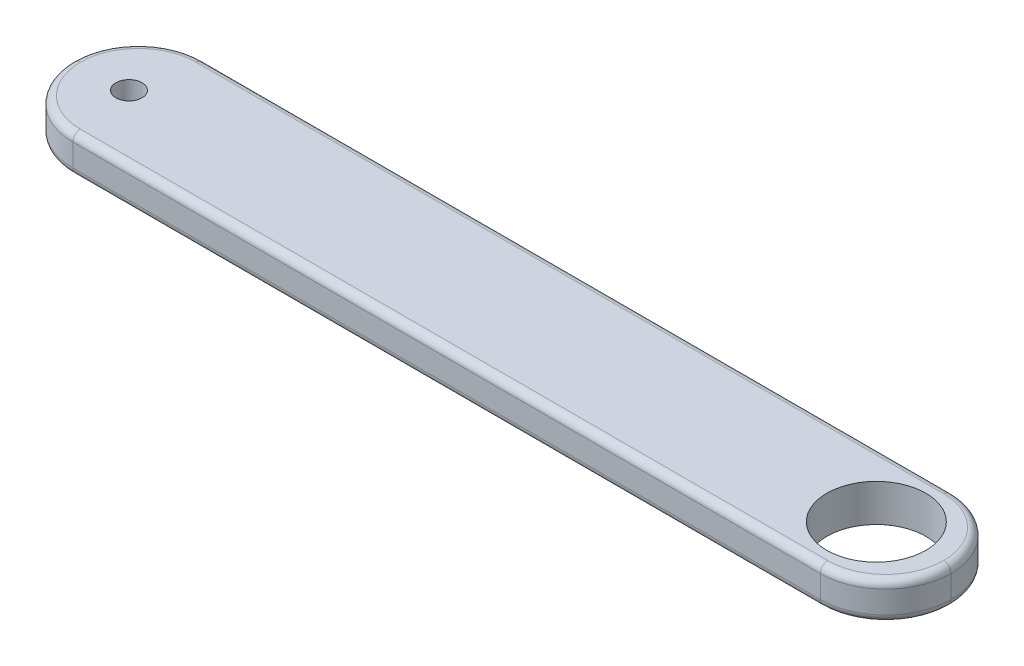
ISO-10303-21;
HEADER;
FILE_DESCRIPTION(('STEP AP214'),'2;1');
FILE_NAME('part.step','',(''),(''),'','','');
FILE_SCHEMA(('AUTOMOTIVE_DESIGN { 1 0 10303 214 1 1 1 1 }'));
ENDSEC;
DATA;
#1=APPLICATION_CONTEXT('core data for automotive mechanical design processes');
#2=APPLICATION_PROTOCOL_DEFINITION('international standard','automotive_design',2000,#1);
#3=PRODUCT_CONTEXT('',#1,'mechanical');
#4=PRODUCT('Part','Part','',(#3));
#5=PRODUCT_RELATED_PRODUCT_CATEGORY('part','',(#4));
#6=PRODUCT_DEFINITION_FORMATION('','',#4);
#7=PRODUCT_DEFINITION_CONTEXT('part definition',#1,'design');
#8=PRODUCT_DEFINITION('design','',#6,#7);
#9=PRODUCT_DEFINITION_SHAPE('','',#8);
#10=(LENGTH_UNIT() NAMED_UNIT(*) SI_UNIT(.MILLI.,.METRE.));
#11=(NAMED_UNIT(*) PLANE_ANGLE_UNIT() SI_UNIT($,.RADIAN.));
#12=(NAMED_UNIT(*) SI_UNIT($,.STERADIAN.) SOLID_ANGLE_UNIT());
#13=UNCERTAINTY_MEASURE_WITH_UNIT(LENGTH_MEASURE(1.E-05),#10,'distance_accuracy_value','');
#14=(GEOMETRIC_REPRESENTATION_CONTEXT(3) GLOBAL_UNCERTAINTY_ASSIGNED_CONTEXT((#13)) GLOBAL_UNIT_ASSIGNED_CONTEXT((#10,
#11,#12)) REPRESENTATION_CONTEXT('',''));
#15=CARTESIAN_POINT('',(0.,0.,0.));
#16=DIRECTION('',(0.,0.,1.));
#17=DIRECTION('',(1.,0.,0.));
#18=AXIS2_PLACEMENT_3D('',#15,#16,#17);
#19=CARTESIAN_POINT('',(0.,10.,0.));
#20=DIRECTION('',(0.,1.,0.));
#21=DIRECTION('',(0.,0.,1.));
#22=AXIS2_PLACEMENT_3D('',#19,#20,#21);
#23=PLANE('',#22);
#24=CARTESIAN_POINT('',(-217.5,10.,-17.5));
#25=DIRECTION('',(0.,1.,0.));
#26=DIRECTION('',(0.,0.,1.));
#27=AXIS2_PLACEMENT_3D('',#24,#25,#26);
#28=CIRCLE('',#27,15.5);
#29=CARTESIAN_POINT('',(-217.5,10.,-33.));
#30=VERTEX_POINT('',#29);
#31=CARTESIAN_POINT('',(-233.,10.,-17.5));
#32=VERTEX_POINT('',#31);
#33=EDGE_CURVE('E49',#30,#32,#28,.T.);
#34=ORIENTED_EDGE('',*,*,#33,.T.);
#35=CARTESIAN_POINT('',(-217.5,10.,-17.5));
#36=DIRECTION('',(0.,1.,0.));
#37=DIRECTION('',(0.,0.,1.));
#38=AXIS2_PLACEMENT_3D('',#35,#36,#37);
#39=CIRCLE('',#38,15.5);
#40=CARTESIAN_POINT('',(-217.5,10.,-1.99999999999997));
#41=VERTEX_POINT('',#40);
#42=EDGE_CURVE('E210',#32,#41,#39,.T.);
#43=ORIENTED_EDGE('',*,*,#42,.T.);
#44=DIRECTION('',(1.,0.,0.));
#45=VECTOR('',#44,1.);
#46=CARTESIAN_POINT('',(-17.5,10.,-2.));
#47=LINE('',#46,#45);
#48=CARTESIAN_POINT('',(-17.5,10.,-2.));
#49=VERTEX_POINT('',#48);
#50=EDGE_CURVE('E202',#41,#49,#47,.T.);
#51=ORIENTED_EDGE('',*,*,#50,.T.);
#52=CARTESIAN_POINT('',(-17.5,10.,-17.5));
#53=DIRECTION('',(0.,1.,0.));
#54=DIRECTION('',(0.,0.,1.));
#55=AXIS2_PLACEMENT_3D('',#52,#53,#54);
#56=CIRCLE('',#55,15.5);
#57=CARTESIAN_POINT('',(-2.,10.,-17.5));
#58=VERTEX_POINT('',#57);
#59=EDGE_CURVE('E204',#49,#58,#56,.T.);
#60=ORIENTED_EDGE('',*,*,#59,.T.);
#61=CARTESIAN_POINT('',(-17.5,10.,-17.5));
#62=DIRECTION('',(0.,1.,0.));
#63=DIRECTION('',(0.,0.,1.));
#64=AXIS2_PLACEMENT_3D('',#61,#62,#63);
#65=CIRCLE('',#64,15.5);
#66=CARTESIAN_POINT('',(-17.5,10.,-33.));
#67=VERTEX_POINT('',#66);
#68=EDGE_CURVE('E206',#58,#67,#65,.T.);
#69=ORIENTED_EDGE('',*,*,#68,.T.);
#70=DIRECTION('',(-1.,0.,0.));
#71=VECTOR('',#70,1.);
#72=CARTESIAN_POINT('',(-217.5,10.,-33.));
#73=LINE('',#72,#71);
#74=EDGE_CURVE('E54',#67,#30,#73,.T.);
#75=ORIENTED_EDGE('',*,*,#74,.T.);
#76=EDGE_LOOP('',(#34,#43,#51,#60,#69,#75));
#77=FACE_BOUND('',#76,.T.);
#78=CARTESIAN_POINT('',(-20.,10.,-17.5));
#79=DIRECTION('',(0.,1.,0.));
#80=DIRECTION('',(0.,0.,1.));
#81=AXIS2_PLACEMENT_3D('',#78,#79,#80);
#82=CIRCLE('',#81,13.25);
#83=CARTESIAN_POINT('',(-20.,10.,-4.25));
#84=VERTEX_POINT('',#83);
#85=EDGE_CURVE('E166',#84,#84,#82,.T.);
#86=ORIENTED_EDGE('',*,*,#85,.F.);
#87=EDGE_LOOP('',(#86));
#88=FACE_BOUND('',#87,.T.);
#89=CARTESIAN_POINT('',(-220.,10.,-17.5));
#90=DIRECTION('',(0.,1.,0.));
#91=DIRECTION('',(0.,0.,1.));
#92=AXIS2_PLACEMENT_3D('',#89,#90,#91);
#93=CIRCLE('',#92,3.49999999999999);
#94=CARTESIAN_POINT('',(-220.,10.,-14.));
#95=VERTEX_POINT('',#94);
#96=EDGE_CURVE('E293',#95,#95,#93,.T.);
#97=ORIENTED_EDGE('',*,*,#96,.F.);
#98=EDGE_LOOP('',(#97));
#99=FACE_BOUND('',#98,.T.);
#100=ADVANCED_FACE('F32',(#77,#88,#99),#23,.T.);
#101=CARTESIAN_POINT('',(0.,0.,0.));
#102=DIRECTION('',(0.,1.,0.));
#103=DIRECTION('',(0.,0.,1.));
#104=AXIS2_PLACEMENT_3D('',#101,#102,#103);
#105=PLANE('',#104);
#106=CARTESIAN_POINT('',(-17.5,0.,-17.5));
#107=DIRECTION('',(0.,1.,0.));
#108=DIRECTION('',(0.,0.,1.));
#109=AXIS2_PLACEMENT_3D('',#106,#107,#108);
#110=CIRCLE('',#109,15.5);
#111=CARTESIAN_POINT('',(-2.,0.,-17.5));
#112=VERTEX_POINT('',#111);
#113=CARTESIAN_POINT('',(-17.5,0.,-2.));
#114=VERTEX_POINT('',#113);
#115=EDGE_CURVE('E187',#112,#114,#110,.F.);
#116=ORIENTED_EDGE('',*,*,#115,.T.);
#117=DIRECTION('',(1.,0.,0.));
#118=VECTOR('',#117,1.);
#119=CARTESIAN_POINT('',(0.,0.,-2.));
#120=LINE('',#119,#118);
#121=CARTESIAN_POINT('',(-217.5,0.,-1.99999999999997));
#122=VERTEX_POINT('',#121);
#123=EDGE_CURVE('E130',#114,#122,#120,.F.);
#124=ORIENTED_EDGE('',*,*,#123,.T.);
#125=CARTESIAN_POINT('',(-217.5,0.,-17.5));
#126=DIRECTION('',(0.,1.,0.));
#127=DIRECTION('',(0.,0.,1.));
#128=AXIS2_PLACEMENT_3D('',#125,#126,#127);
#129=CIRCLE('',#128,15.5);
#130=CARTESIAN_POINT('',(-233.,0.,-17.5));
#131=VERTEX_POINT('',#130);
#132=EDGE_CURVE('E156',#122,#131,#129,.F.);
#133=ORIENTED_EDGE('',*,*,#132,.T.);
#134=CARTESIAN_POINT('',(-217.5,0.,-17.5));
#135=DIRECTION('',(0.,1.,0.));
#136=DIRECTION('',(0.,0.,1.));
#137=AXIS2_PLACEMENT_3D('',#134,#135,#136);
#138=CIRCLE('',#137,15.5);
#139=CARTESIAN_POINT('',(-217.5,0.,-33.));
#140=VERTEX_POINT('',#139);
#141=EDGE_CURVE('E181',#131,#140,#138,.F.);
#142=ORIENTED_EDGE('',*,*,#141,.T.);
#143=DIRECTION('',(-1.,0.,0.));
#144=VECTOR('',#143,1.);
#145=CARTESIAN_POINT('',(0.,0.,-33.));
#146=LINE('',#145,#144);
#147=CARTESIAN_POINT('',(-17.5,0.,-33.));
#148=VERTEX_POINT('',#147);
#149=EDGE_CURVE('E183',#140,#148,#146,.F.);
#150=ORIENTED_EDGE('',*,*,#149,.T.);
#151=CARTESIAN_POINT('',(-17.5,0.,-17.5));
#152=DIRECTION('',(0.,1.,0.));
#153=DIRECTION('',(0.,0.,1.));
#154=AXIS2_PLACEMENT_3D('',#151,#152,#153);
#155=CIRCLE('',#154,15.5);
#156=EDGE_CURVE('E185',#148,#112,#155,.F.);
#157=ORIENTED_EDGE('',*,*,#156,.T.);
#158=EDGE_LOOP('',(#116,#124,#133,#142,#150,#157));
#159=FACE_BOUND('',#158,.T.);
#160=CARTESIAN_POINT('',(-20.,0.,-17.5));
#161=DIRECTION('',(0.,1.,0.));
#162=DIRECTION('',(0.,0.,1.));
#163=AXIS2_PLACEMENT_3D('',#160,#161,#162);
#164=CIRCLE('',#163,13.25);
#165=CARTESIAN_POINT('',(-20.,0.,-4.25));
#166=VERTEX_POINT('',#165);
#167=EDGE_CURVE('E295',#166,#166,#164,.T.);
#168=ORIENTED_EDGE('',*,*,#167,.T.);
#169=EDGE_LOOP('',(#168));
#170=FACE_BOUND('',#169,.T.);
#171=CARTESIAN_POINT('',(-220.,0.,-17.5));
#172=DIRECTION('',(0.,1.,0.));
#173=DIRECTION('',(0.,0.,1.));
#174=AXIS2_PLACEMENT_3D('',#171,#172,#173);
#175=CIRCLE('',#174,3.49999999999999);
#176=CARTESIAN_POINT('',(-220.,0.,-14.));
#177=VERTEX_POINT('',#176);
#178=EDGE_CURVE('E174',#177,#177,#175,.T.);
#179=ORIENTED_EDGE('',*,*,#178,.T.);
#180=EDGE_LOOP('',(#179));
#181=FACE_BOUND('',#180,.T.);
#182=ADVANCED_FACE('F263',(#159,#170,#181),#105,.F.);
#183=CARTESIAN_POINT('',(0.,10.,-35.));
#184=DIRECTION('',(0.,0.,1.));
#185=DIRECTION('',(1.,0.,0.));
#186=AXIS2_PLACEMENT_3D('',#183,#184,#185);
#187=PLANE('',#186);
#188=DIRECTION('',(0.,-1.,0.));
#189=VECTOR('',#188,1.);
#190=CARTESIAN_POINT('',(-17.5,10.,-35.));
#191=LINE('',#190,#189);
#192=CARTESIAN_POINT('',(-17.5,8.,-35.));
#193=VERTEX_POINT('',#192);
#194=CARTESIAN_POINT('',(-17.5,2.,-35.));
#195=VERTEX_POINT('',#194);
#196=EDGE_CURVE('E164',#193,#195,#191,.T.);
#197=ORIENTED_EDGE('',*,*,#196,.T.);
#198=DIRECTION('',(-1.,0.,0.));
#199=VECTOR('',#198,1.);
#200=CARTESIAN_POINT('',(0.,2.,-35.));
#201=LINE('',#200,#199);
#202=CARTESIAN_POINT('',(-217.5,2.,-35.));
#203=VERTEX_POINT('',#202);
#204=EDGE_CURVE('E196',#195,#203,#201,.T.);
#205=ORIENTED_EDGE('',*,*,#204,.T.);
#206=DIRECTION('',(0.,-1.,0.));
#207=VECTOR('',#206,1.);
#208=CARTESIAN_POINT('',(-217.5,10.,-35.));
#209=LINE('',#208,#207);
#210=CARTESIAN_POINT('',(-217.5,8.,-35.));
#211=VERTEX_POINT('',#210);
#212=EDGE_CURVE('E161',#203,#211,#209,.F.);
#213=ORIENTED_EDGE('',*,*,#212,.T.);
#214=DIRECTION('',(-1.,0.,0.));
#215=VECTOR('',#214,1.);
#216=CARTESIAN_POINT('',(-17.5,8.,-35.));
#217=LINE('',#216,#215);
#218=EDGE_CURVE('E194',#211,#193,#217,.F.);
#219=ORIENTED_EDGE('',*,*,#218,.T.);
#220=EDGE_LOOP('',(#197,#205,#213,#219));
#221=FACE_BOUND('',#220,.T.);
#222=ADVANCED_FACE('F251',(#221),#187,.F.);
#223=CARTESIAN_POINT('',(0.,10.,0.));
#224=DIRECTION('',(0.,0.,-1.));
#225=DIRECTION('',(-1.,0.,0.));
#226=AXIS2_PLACEMENT_3D('',#223,#224,#225);
#227=PLANE('',#226);
#228=DIRECTION('',(0.,-1.,0.));
#229=VECTOR('',#228,1.);
#230=CARTESIAN_POINT('',(-217.5,10.,0.));
#231=LINE('',#230,#229);
#232=CARTESIAN_POINT('',(-217.5,8.,0.));
#233=VERTEX_POINT('',#232);
#234=CARTESIAN_POINT('',(-217.5,2.,0.));
#235=VERTEX_POINT('',#234);
#236=EDGE_CURVE('E154',#233,#235,#231,.T.);
#237=ORIENTED_EDGE('',*,*,#236,.T.);
#238=DIRECTION('',(1.,0.,0.));
#239=VECTOR('',#238,1.);
#240=CARTESIAN_POINT('',(0.,2.,0.));
#241=LINE('',#240,#239);
#242=CARTESIAN_POINT('',(-17.5,2.,0.));
#243=VERTEX_POINT('',#242);
#244=EDGE_CURVE('E128',#235,#243,#241,.T.);
#245=ORIENTED_EDGE('',*,*,#244,.T.);
#246=DIRECTION('',(0.,-1.,0.));
#247=VECTOR('',#246,1.);
#248=CARTESIAN_POINT('',(-17.5,10.,0.));
#249=LINE('',#248,#247);
#250=CARTESIAN_POINT('',(-17.5,8.,0.));
#251=VERTEX_POINT('',#250);
#252=EDGE_CURVE('E151',#243,#251,#249,.F.);
#253=ORIENTED_EDGE('',*,*,#252,.T.);
#254=DIRECTION('',(1.,0.,0.));
#255=VECTOR('',#254,1.);
#256=CARTESIAN_POINT('',(-217.5,8.,0.));
#257=LINE('',#256,#255);
#258=EDGE_CURVE('E157',#251,#233,#257,.F.);
#259=ORIENTED_EDGE('',*,*,#258,.T.);
#260=EDGE_LOOP('',(#237,#245,#253,#259));
#261=FACE_BOUND('',#260,.T.);
#262=ADVANCED_FACE('F150',(#261),#227,.F.);
#263=CARTESIAN_POINT('',(-20.,10.,-17.5));
#264=DIRECTION('',(0.,-1.,0.));
#265=DIRECTION('',(0.,0.,-1.));
#266=AXIS2_PLACEMENT_3D('',#263,#264,#265);
#267=CYLINDRICAL_SURFACE('',#266,13.25);
#268=ORIENTED_EDGE('',*,*,#85,.T.);
#269=EDGE_LOOP('',(#268));
#270=FACE_BOUND('',#269,.T.);
#271=ORIENTED_EDGE('',*,*,#167,.F.);
#272=EDGE_LOOP('',(#271));
#273=FACE_BOUND('',#272,.T.);
#274=ADVANCED_FACE('F302',(#270,#273),#267,.F.);
#275=CARTESIAN_POINT('',(-220.,10.,-17.5));
#276=DIRECTION('',(0.,-1.,0.));
#277=DIRECTION('',(0.,0.,-1.));
#278=AXIS2_PLACEMENT_3D('',#275,#276,#277);
#279=CYLINDRICAL_SURFACE('',#278,3.49999999999999);
#280=ORIENTED_EDGE('',*,*,#96,.T.);
#281=EDGE_LOOP('',(#280));
#282=FACE_BOUND('',#281,.T.);
#283=ORIENTED_EDGE('',*,*,#178,.F.);
#284=EDGE_LOOP('',(#283));
#285=FACE_BOUND('',#284,.T.);
#286=ADVANCED_FACE('F305',(#282,#285),#279,.F.);
#287=CARTESIAN_POINT('',(-17.5,10.,-17.5));
#288=DIRECTION('',(0.,-1.,0.));
#289=DIRECTION('',(0.,0.,-1.));
#290=AXIS2_PLACEMENT_3D('',#287,#288,#289);
#291=CYLINDRICAL_SURFACE('',#290,17.5);
#292=DIRECTION('',(0.,-1.,0.));
#293=VECTOR('',#292,1.);
#294=CARTESIAN_POINT('',(0.,10.,-17.5));
#295=LINE('',#294,#293);
#296=CARTESIAN_POINT('',(0.,2.,-17.5));
#297=VERTEX_POINT('',#296);
#298=CARTESIAN_POINT('',(0.,8.,-17.5));
#299=VERTEX_POINT('',#298);
#300=EDGE_CURVE('E172',#297,#299,#295,.F.);
#301=ORIENTED_EDGE('',*,*,#300,.F.);
#302=CARTESIAN_POINT('',(-17.5,2.,-17.5));
#303=DIRECTION('',(0.,1.,0.));
#304=DIRECTION('',(0.,0.,1.));
#305=AXIS2_PLACEMENT_3D('',#302,#303,#304);
#306=CIRCLE('',#305,17.5);
#307=EDGE_CURVE('E192',#297,#195,#306,.T.);
#308=ORIENTED_EDGE('',*,*,#307,.T.);
#309=ORIENTED_EDGE('',*,*,#196,.F.);
#310=CARTESIAN_POINT('',(-17.5,8.,-17.5));
#311=DIRECTION('',(0.,1.,0.));
#312=DIRECTION('',(0.,0.,1.));
#313=AXIS2_PLACEMENT_3D('',#310,#311,#312);
#314=CIRCLE('',#313,17.5);
#315=EDGE_CURVE('E144',#193,#299,#314,.F.);
#316=ORIENTED_EDGE('',*,*,#315,.T.);
#317=EDGE_LOOP('',(#301,#308,#309,#316));
#318=FACE_BOUND('',#317,.T.);
#319=ADVANCED_FACE('F247',(#318),#291,.T.);
#320=CARTESIAN_POINT('',(-17.5,10.,-17.5));
#321=DIRECTION('',(0.,-1.,0.));
#322=DIRECTION('',(0.,0.,-1.));
#323=AXIS2_PLACEMENT_3D('',#320,#321,#322);
#324=CYLINDRICAL_SURFACE('',#323,17.5);
#325=ORIENTED_EDGE('',*,*,#252,.F.);
#326=CARTESIAN_POINT('',(-17.5,2.,-17.5));
#327=DIRECTION('',(0.,1.,0.));
#328=DIRECTION('',(0.,0.,1.));
#329=AXIS2_PLACEMENT_3D('',#326,#327,#328);
#330=CIRCLE('',#329,17.5);
#331=EDGE_CURVE('E136',#243,#297,#330,.T.);
#332=ORIENTED_EDGE('',*,*,#331,.T.);
#333=ORIENTED_EDGE('',*,*,#300,.T.);
#334=CARTESIAN_POINT('',(-17.5,8.,-17.5));
#335=DIRECTION('',(0.,1.,0.));
#336=DIRECTION('',(0.,0.,1.));
#337=AXIS2_PLACEMENT_3D('',#334,#335,#336);
#338=CIRCLE('',#337,17.5);
#339=EDGE_CURVE('E145',#299,#251,#338,.F.);
#340=ORIENTED_EDGE('',*,*,#339,.T.);
#341=EDGE_LOOP('',(#325,#332,#333,#340));
#342=FACE_BOUND('',#341,.T.);
#343=ADVANCED_FACE('F159',(#342),#324,.T.);
#344=CARTESIAN_POINT('',(-217.5,10.,-17.5));
#345=DIRECTION('',(0.,-1.,0.));
#346=DIRECTION('',(0.,0.,-1.));
#347=AXIS2_PLACEMENT_3D('',#344,#345,#346);
#348=CYLINDRICAL_SURFACE('',#347,17.5);
#349=ORIENTED_EDGE('',*,*,#236,.F.);
#350=CARTESIAN_POINT('',(-217.5,8.,-17.5));
#351=DIRECTION('',(0.,1.,0.));
#352=DIRECTION('',(0.,0.,1.));
#353=AXIS2_PLACEMENT_3D('',#350,#351,#352);
#354=CIRCLE('',#353,17.5);
#355=CARTESIAN_POINT('',(-235.,8.,-17.5));
#356=VERTEX_POINT('',#355);
#357=EDGE_CURVE('E11',#233,#356,#354,.F.);
#358=ORIENTED_EDGE('',*,*,#357,.T.);
#359=DIRECTION('',(0.,-1.,0.));
#360=VECTOR('',#359,1.);
#361=CARTESIAN_POINT('',(-235.,10.,-17.5));
#362=LINE('',#361,#360);
#363=CARTESIAN_POINT('',(-235.,2.,-17.5));
#364=VERTEX_POINT('',#363);
#365=EDGE_CURVE('E175',#364,#356,#362,.F.);
#366=ORIENTED_EDGE('',*,*,#365,.F.);
#367=CARTESIAN_POINT('',(-217.5,2.,-17.5));
#368=DIRECTION('',(0.,1.,0.));
#369=DIRECTION('',(0.,0.,1.));
#370=AXIS2_PLACEMENT_3D('',#367,#368,#369);
#371=CIRCLE('',#370,17.5);
#372=EDGE_CURVE('E41',#364,#235,#371,.T.);
#373=ORIENTED_EDGE('',*,*,#372,.T.);
#374=EDGE_LOOP('',(#349,#358,#366,#373));
#375=FACE_BOUND('',#374,.T.);
#376=ADVANCED_FACE('F274',(#375),#348,.T.);
#377=CARTESIAN_POINT('',(-217.5,10.,-17.5));
#378=DIRECTION('',(0.,-1.,0.));
#379=DIRECTION('',(0.,0.,-1.));
#380=AXIS2_PLACEMENT_3D('',#377,#378,#379);
#381=CYLINDRICAL_SURFACE('',#380,17.5);
#382=ORIENTED_EDGE('',*,*,#212,.F.);
#383=CARTESIAN_POINT('',(-217.5,2.,-17.5));
#384=DIRECTION('',(0.,1.,0.));
#385=DIRECTION('',(0.,0.,1.));
#386=AXIS2_PLACEMENT_3D('',#383,#384,#385);
#387=CIRCLE('',#386,17.5);
#388=EDGE_CURVE('E200',#203,#364,#387,.T.);
#389=ORIENTED_EDGE('',*,*,#388,.T.);
#390=ORIENTED_EDGE('',*,*,#365,.T.);
#391=CARTESIAN_POINT('',(-217.5,8.,-17.5));
#392=DIRECTION('',(0.,1.,0.));
#393=DIRECTION('',(0.,0.,1.));
#394=AXIS2_PLACEMENT_3D('',#391,#392,#393);
#395=CIRCLE('',#394,17.5);
#396=EDGE_CURVE('E198',#356,#211,#395,.F.);
#397=ORIENTED_EDGE('',*,*,#396,.T.);
#398=EDGE_LOOP('',(#382,#389,#390,#397));
#399=FACE_BOUND('',#398,.T.);
#400=ADVANCED_FACE('F272',(#399),#381,.T.);
#401=CARTESIAN_POINT('',(0.,2.,-33.));
#402=DIRECTION('',(-1.,0.,0.));
#403=DIRECTION('',(0.,0.,1.));
#404=AXIS2_PLACEMENT_3D('',#401,#402,#403);
#405=CYLINDRICAL_SURFACE('',#404,2.);
#406=CARTESIAN_POINT('',(-17.5,2.,-33.));
#407=DIRECTION('',(1.,0.,0.));
#408=DIRECTION('',(0.,0.,-1.));
#409=AXIS2_PLACEMENT_3D('',#406,#407,#408);
#410=CIRCLE('',#409,2.);
#411=EDGE_CURVE('E218',#148,#195,#410,.T.);
#412=ORIENTED_EDGE('',*,*,#411,.F.);
#413=ORIENTED_EDGE('',*,*,#149,.F.);
#414=CARTESIAN_POINT('',(-217.5,2.,-33.));
#415=DIRECTION('',(-1.,0.,0.));
#416=DIRECTION('',(0.,0.,1.));
#417=AXIS2_PLACEMENT_3D('',#414,#415,#416);
#418=CIRCLE('',#417,2.);
#419=EDGE_CURVE('E178',#203,#140,#418,.T.);
#420=ORIENTED_EDGE('',*,*,#419,.F.);
#421=ORIENTED_EDGE('',*,*,#204,.F.);
#422=EDGE_LOOP('',(#412,#413,#420,#421));
#423=FACE_BOUND('',#422,.T.);
#424=ADVANCED_FACE('F256',(#423),#405,.T.);
#425=CARTESIAN_POINT('',(-217.5,2.,-17.5));
#426=DIRECTION('',(0.,1.,0.));
#427=DIRECTION('',(0.,0.,1.));
#428=AXIS2_PLACEMENT_3D('',#425,#426,#427);
#429=TOROIDAL_SURFACE('',#428,15.5,2.);
#430=ORIENTED_EDGE('',*,*,#419,.T.);
#431=ORIENTED_EDGE('',*,*,#141,.F.);
#432=CARTESIAN_POINT('',(-233.,2.,-17.5));
#433=DIRECTION('',(0.,0.,1.));
#434=DIRECTION('',(1.,0.,0.));
#435=AXIS2_PLACEMENT_3D('',#432,#433,#434);
#436=CIRCLE('',#435,2.);
#437=EDGE_CURVE('E215',#364,#131,#436,.T.);
#438=ORIENTED_EDGE('',*,*,#437,.F.);
#439=ORIENTED_EDGE('',*,*,#388,.F.);
#440=EDGE_LOOP('',(#430,#431,#438,#439));
#441=FACE_BOUND('',#440,.T.);
#442=ADVANCED_FACE('F267',(#441),#429,.T.);
#443=CARTESIAN_POINT('',(-17.5,2.,-17.5));
#444=DIRECTION('',(0.,1.,0.));
#445=DIRECTION('',(0.,0.,1.));
#446=AXIS2_PLACEMENT_3D('',#443,#444,#445);
#447=TOROIDAL_SURFACE('',#446,15.5,2.);
#448=ORIENTED_EDGE('',*,*,#411,.T.);
#449=ORIENTED_EDGE('',*,*,#307,.F.);
#450=CARTESIAN_POINT('',(-2.,2.,-17.5));
#451=DIRECTION('',(0.,0.,1.));
#452=DIRECTION('',(1.,0.,0.));
#453=AXIS2_PLACEMENT_3D('',#450,#451,#452);
#454=CIRCLE('',#453,2.);
#455=EDGE_CURVE('E139',#112,#297,#454,.T.);
#456=ORIENTED_EDGE('',*,*,#455,.F.);
#457=ORIENTED_EDGE('',*,*,#156,.F.);
#458=EDGE_LOOP('',(#448,#449,#456,#457));
#459=FACE_BOUND('',#458,.T.);
#460=ADVANCED_FACE('F261',(#459),#447,.T.);
#461=CARTESIAN_POINT('',(-217.5,2.,-17.5));
#462=DIRECTION('',(0.,1.,0.));
#463=DIRECTION('',(0.,0.,1.));
#464=AXIS2_PLACEMENT_3D('',#461,#462,#463);
#465=TOROIDAL_SURFACE('',#464,15.5,2.);
#466=ORIENTED_EDGE('',*,*,#437,.T.);
#467=ORIENTED_EDGE('',*,*,#132,.F.);
#468=CARTESIAN_POINT('',(-217.5,2.,-1.99999999999997));
#469=DIRECTION('',(1.,0.,0.));
#470=DIRECTION('',(0.,0.,-1.));
#471=AXIS2_PLACEMENT_3D('',#468,#469,#470);
#472=CIRCLE('',#471,2.);
#473=EDGE_CURVE('E133',#235,#122,#472,.T.);
#474=ORIENTED_EDGE('',*,*,#473,.F.);
#475=ORIENTED_EDGE('',*,*,#372,.F.);
#476=EDGE_LOOP('',(#466,#467,#474,#475));
#477=FACE_BOUND('',#476,.T.);
#478=ADVANCED_FACE('F334',(#477),#465,.T.);
#479=CARTESIAN_POINT('',(-17.5,2.,-17.5));
#480=DIRECTION('',(0.,1.,0.));
#481=DIRECTION('',(0.,0.,1.));
#482=AXIS2_PLACEMENT_3D('',#479,#480,#481);
#483=TOROIDAL_SURFACE('',#482,15.5,2.);
#484=ORIENTED_EDGE('',*,*,#455,.T.);
#485=ORIENTED_EDGE('',*,*,#331,.F.);
#486=CARTESIAN_POINT('',(-17.5,2.,-2.));
#487=DIRECTION('',(-1.,0.,0.));
#488=DIRECTION('',(0.,0.,1.));
#489=AXIS2_PLACEMENT_3D('',#486,#487,#488);
#490=CIRCLE('',#489,2.);
#491=EDGE_CURVE('E124',#114,#243,#490,.T.);
#492=ORIENTED_EDGE('',*,*,#491,.F.);
#493=ORIENTED_EDGE('',*,*,#115,.F.);
#494=EDGE_LOOP('',(#484,#485,#492,#493));
#495=FACE_BOUND('',#494,.T.);
#496=ADVANCED_FACE('F137',(#495),#483,.T.);
#497=CARTESIAN_POINT('',(0.,2.,-2.));
#498=DIRECTION('',(1.,0.,0.));
#499=DIRECTION('',(0.,0.,-1.));
#500=AXIS2_PLACEMENT_3D('',#497,#498,#499);
#501=CYLINDRICAL_SURFACE('',#500,2.);
#502=ORIENTED_EDGE('',*,*,#473,.T.);
#503=ORIENTED_EDGE('',*,*,#123,.F.);
#504=ORIENTED_EDGE('',*,*,#491,.T.);
#505=ORIENTED_EDGE('',*,*,#244,.F.);
#506=EDGE_LOOP('',(#502,#503,#504,#505));
#507=FACE_BOUND('',#506,.T.);
#508=ADVANCED_FACE('F126',(#507),#501,.T.);
#509=CARTESIAN_POINT('',(-17.5,8.,-17.5));
#510=DIRECTION('',(0.,1.,0.));
#511=DIRECTION('',(0.,0.,1.));
#512=AXIS2_PLACEMENT_3D('',#509,#510,#511);
#513=TOROIDAL_SURFACE('',#512,15.5,2.);
#514=CARTESIAN_POINT('',(-2.,8.,-17.5));
#515=DIRECTION('',(0.,0.,1.));
#516=DIRECTION('',(1.,0.,0.));
#517=AXIS2_PLACEMENT_3D('',#514,#515,#516);
#518=CIRCLE('',#517,2.);
#519=EDGE_CURVE('E232',#299,#58,#518,.T.);
#520=ORIENTED_EDGE('',*,*,#519,.F.);
#521=ORIENTED_EDGE('',*,*,#315,.F.);
#522=CARTESIAN_POINT('',(-17.5,8.,-33.));
#523=DIRECTION('',(-1.,0.,0.));
#524=DIRECTION('',(0.,0.,1.));
#525=AXIS2_PLACEMENT_3D('',#522,#523,#524);
#526=CIRCLE('',#525,2.);
#527=EDGE_CURVE('E36',#67,#193,#526,.T.);
#528=ORIENTED_EDGE('',*,*,#527,.F.);
#529=ORIENTED_EDGE('',*,*,#68,.F.);
#530=EDGE_LOOP('',(#520,#521,#528,#529));
#531=FACE_BOUND('',#530,.T.);
#532=ADVANCED_FACE('F34',(#531),#513,.T.);
#533=CARTESIAN_POINT('',(0.,8.,-33.));
#534=DIRECTION('',(1.,0.,0.));
#535=DIRECTION('',(0.,0.,-1.));
#536=AXIS2_PLACEMENT_3D('',#533,#534,#535);
#537=CYLINDRICAL_SURFACE('',#536,2.);
#538=ORIENTED_EDGE('',*,*,#527,.T.);
#539=ORIENTED_EDGE('',*,*,#218,.F.);
#540=CARTESIAN_POINT('',(-217.5,8.,-33.));
#541=DIRECTION('',(-1.,0.,0.));
#542=DIRECTION('',(0.,0.,1.));
#543=AXIS2_PLACEMENT_3D('',#540,#541,#542);
#544=CIRCLE('',#543,2.);
#545=EDGE_CURVE('E230',#30,#211,#544,.T.);
#546=ORIENTED_EDGE('',*,*,#545,.F.);
#547=ORIENTED_EDGE('',*,*,#74,.F.);
#548=EDGE_LOOP('',(#538,#539,#546,#547));
#549=FACE_BOUND('',#548,.T.);
#550=ADVANCED_FACE('F241',(#549),#537,.T.);
#551=CARTESIAN_POINT('',(-17.5,8.,-17.5));
#552=DIRECTION('',(0.,1.,0.));
#553=DIRECTION('',(0.,0.,1.));
#554=AXIS2_PLACEMENT_3D('',#551,#552,#553);
#555=TOROIDAL_SURFACE('',#554,15.5,2.);
#556=ORIENTED_EDGE('',*,*,#519,.T.);
#557=ORIENTED_EDGE('',*,*,#59,.F.);
#558=CARTESIAN_POINT('',(-17.5,8.,-2.));
#559=DIRECTION('',(-1.,0.,0.));
#560=DIRECTION('',(0.,0.,1.));
#561=AXIS2_PLACEMENT_3D('',#558,#559,#560);
#562=CIRCLE('',#561,2.);
#563=EDGE_CURVE('E227',#251,#49,#562,.T.);
#564=ORIENTED_EDGE('',*,*,#563,.F.);
#565=ORIENTED_EDGE('',*,*,#339,.F.);
#566=EDGE_LOOP('',(#556,#557,#564,#565));
#567=FACE_BOUND('',#566,.T.);
#568=ADVANCED_FACE('F351',(#567),#555,.T.);
#569=CARTESIAN_POINT('',(-217.5,8.,-17.5));
#570=DIRECTION('',(0.,1.,0.));
#571=DIRECTION('',(0.,0.,1.));
#572=AXIS2_PLACEMENT_3D('',#569,#570,#571);
#573=TOROIDAL_SURFACE('',#572,15.5,2.);
#574=ORIENTED_EDGE('',*,*,#545,.T.);
#575=ORIENTED_EDGE('',*,*,#396,.F.);
#576=CARTESIAN_POINT('',(-233.,8.,-17.5));
#577=DIRECTION('',(0.,0.,1.));
#578=DIRECTION('',(1.,0.,0.));
#579=AXIS2_PLACEMENT_3D('',#576,#577,#578);
#580=CIRCLE('',#579,2.);
#581=EDGE_CURVE('E225',#32,#356,#580,.T.);
#582=ORIENTED_EDGE('',*,*,#581,.F.);
#583=ORIENTED_EDGE('',*,*,#33,.F.);
#584=EDGE_LOOP('',(#574,#575,#582,#583));
#585=FACE_BOUND('',#584,.T.);
#586=ADVANCED_FACE('F348',(#585),#573,.T.);
#587=CARTESIAN_POINT('',(0.,8.,-2.));
#588=DIRECTION('',(-1.,0.,0.));
#589=DIRECTION('',(0.,0.,1.));
#590=AXIS2_PLACEMENT_3D('',#587,#588,#589);
#591=CYLINDRICAL_SURFACE('',#590,2.);
#592=ORIENTED_EDGE('',*,*,#563,.T.);
#593=ORIENTED_EDGE('',*,*,#50,.F.);
#594=CARTESIAN_POINT('',(-217.5,8.,-1.99999999999997));
#595=DIRECTION('',(-1.,0.,0.));
#596=DIRECTION('',(0.,0.,1.));
#597=AXIS2_PLACEMENT_3D('',#594,#595,#596);
#598=CIRCLE('',#597,2.);
#599=EDGE_CURVE('E223',#233,#41,#598,.T.);
#600=ORIENTED_EDGE('',*,*,#599,.F.);
#601=ORIENTED_EDGE('',*,*,#258,.F.);
#602=EDGE_LOOP('',(#592,#593,#600,#601));
#603=FACE_BOUND('',#602,.T.);
#604=ADVANCED_FACE('F284',(#603),#591,.T.);
#605=CARTESIAN_POINT('',(-217.5,8.,-17.5));
#606=DIRECTION('',(0.,1.,0.));
#607=DIRECTION('',(0.,0.,1.));
#608=AXIS2_PLACEMENT_3D('',#605,#606,#607);
#609=TOROIDAL_SURFACE('',#608,15.5,2.);
#610=ORIENTED_EDGE('',*,*,#581,.T.);
#611=ORIENTED_EDGE('',*,*,#357,.F.);
#612=ORIENTED_EDGE('',*,*,#599,.T.);
#613=ORIENTED_EDGE('',*,*,#42,.F.);
#614=EDGE_LOOP('',(#610,#611,#612,#613));
#615=FACE_BOUND('',#614,.T.);
#616=ADVANCED_FACE('F278',(#615),#609,.T.);
#617=CLOSED_SHELL('',(#100,#182,#222,#262,#274,#286,#319,#343,#376,#400,#424,#442,#460,#478,
#496,#508,#532,#550,#568,#586,#604,#616));
#618=MANIFOLD_SOLID_BREP('B2',#617);
#619=ADVANCED_BREP_SHAPE_REPRESENTATION('',(#18,#618),#14);
#620=SHAPE_DEFINITION_REPRESENTATION(#9,#619);
ENDSEC;
END-ISO-10303-21;
